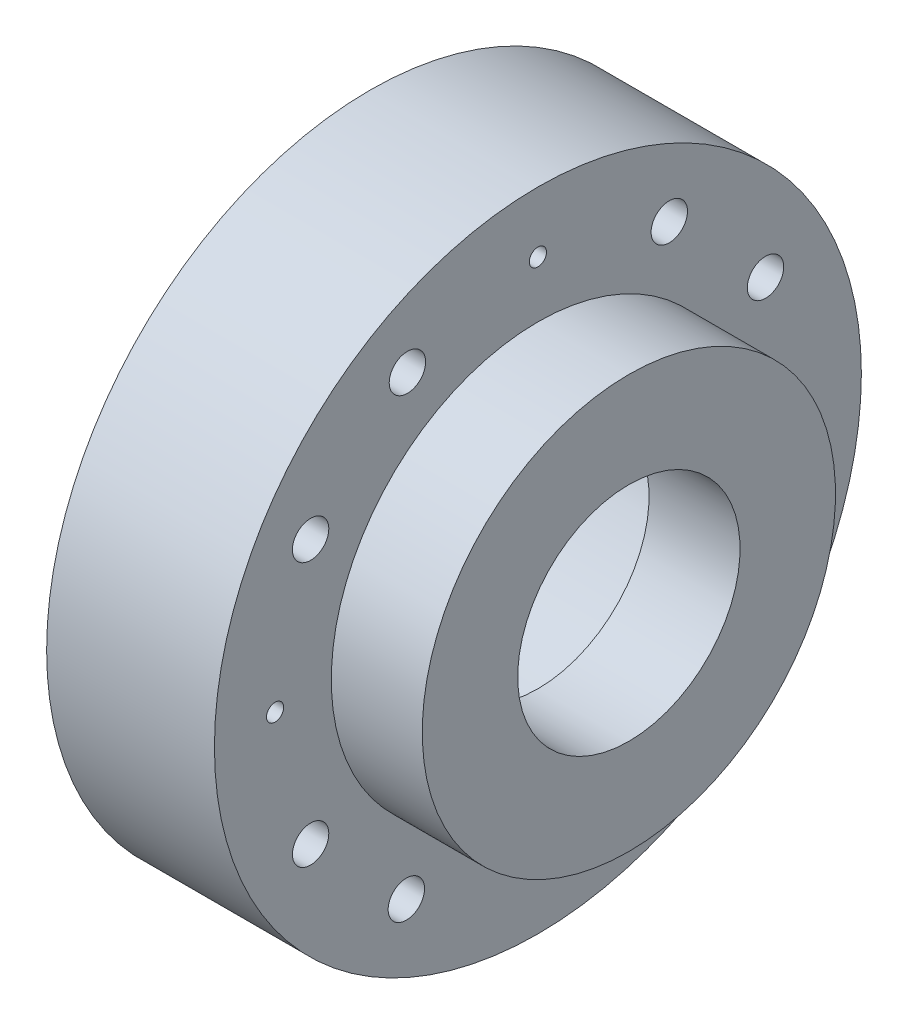
ISO-10303-21;
HEADER;
FILE_DESCRIPTION(('STEP AP214'),'2;1');
FILE_NAME('part.step','',(''),(''),'','','');
FILE_SCHEMA(('AUTOMOTIVE_DESIGN { 1 0 10303 214 1 1 1 1 }'));
ENDSEC;
DATA;
#1=APPLICATION_CONTEXT('core data for automotive mechanical design processes');
#2=APPLICATION_PROTOCOL_DEFINITION('international standard','automotive_design',2000,#1);
#3=PRODUCT_CONTEXT('',#1,'mechanical');
#4=PRODUCT('Part','Part','',(#3));
#5=PRODUCT_RELATED_PRODUCT_CATEGORY('part','',(#4));
#6=PRODUCT_DEFINITION_FORMATION('','',#4);
#7=PRODUCT_DEFINITION_CONTEXT('part definition',#1,'design');
#8=PRODUCT_DEFINITION('design','',#6,#7);
#9=PRODUCT_DEFINITION_SHAPE('','',#8);
#10=(LENGTH_UNIT() NAMED_UNIT(*) SI_UNIT(.MILLI.,.METRE.));
#11=(NAMED_UNIT(*) PLANE_ANGLE_UNIT() SI_UNIT($,.RADIAN.));
#12=(NAMED_UNIT(*) SI_UNIT($,.STERADIAN.) SOLID_ANGLE_UNIT());
#13=UNCERTAINTY_MEASURE_WITH_UNIT(LENGTH_MEASURE(1.E-05),#10,'distance_accuracy_value','');
#14=(GEOMETRIC_REPRESENTATION_CONTEXT(3) GLOBAL_UNCERTAINTY_ASSIGNED_CONTEXT((#13)) GLOBAL_UNIT_ASSIGNED_CONTEXT((#10,
#11,#12)) REPRESENTATION_CONTEXT('',''));
#15=CARTESIAN_POINT('',(0.,0.,0.));
#16=DIRECTION('',(0.,0.,1.));
#17=DIRECTION('',(1.,0.,0.));
#18=AXIS2_PLACEMENT_3D('',#15,#16,#17);
#19=CARTESIAN_POINT('',(0.,0.,0.));
#20=DIRECTION('',(-1.,0.,0.));
#21=DIRECTION('',(0.,-1.,0.));
#22=AXIS2_PLACEMENT_3D('',#19,#20,#21);
#23=PLANE('',#22);
#24=CARTESIAN_POINT('',(0.,0.,0.));
#25=DIRECTION('',(-1.,0.,0.));
#26=DIRECTION('',(0.,-1.,0.));
#27=AXIS2_PLACEMENT_3D('',#24,#25,#26);
#28=CIRCLE('',#27,55.);
#29=CARTESIAN_POINT('',(0.,-55.,0.));
#30=VERTEX_POINT('',#29);
#31=EDGE_CURVE('E215',#30,#30,#28,.T.);
#32=ORIENTED_EDGE('',*,*,#31,.T.);
#33=EDGE_LOOP('',(#32));
#34=FACE_BOUND('',#33,.T.);
#35=CARTESIAN_POINT('',(0.,0.,0.));
#36=DIRECTION('',(-1.,0.,0.));
#37=DIRECTION('',(0.,-1.,0.));
#38=AXIS2_PLACEMENT_3D('',#35,#36,#37);
#39=CIRCLE('',#38,102.2);
#40=CARTESIAN_POINT('',(0.,-102.2,0.));
#41=VERTEX_POINT('',#40);
#42=EDGE_CURVE('E10',#41,#41,#39,.T.);
#43=ORIENTED_EDGE('',*,*,#42,.F.);
#44=EDGE_LOOP('',(#43));
#45=FACE_BOUND('',#44,.T.);
#46=ADVANCED_FACE('F45',(#34,#45),#23,.F.);
#47=CARTESIAN_POINT('',(-45.,0.,0.));
#48=DIRECTION('',(-1.,0.,0.));
#49=DIRECTION('',(0.,-1.,0.));
#50=AXIS2_PLACEMENT_3D('',#47,#48,#49);
#51=CYLINDRICAL_SURFACE('',#50,102.2);
#52=CARTESIAN_POINT('',(-45.,0.,0.));
#53=DIRECTION('',(-1.,0.,0.));
#54=DIRECTION('',(0.,-1.,0.));
#55=AXIS2_PLACEMENT_3D('',#52,#53,#54);
#56=CIRCLE('',#55,102.2);
#57=CARTESIAN_POINT('',(-45.,-102.2,0.));
#58=VERTEX_POINT('',#57);
#59=EDGE_CURVE('E53',#58,#58,#56,.T.);
#60=ORIENTED_EDGE('',*,*,#59,.F.);
#61=EDGE_LOOP('',(#60));
#62=FACE_BOUND('',#61,.T.);
#63=ORIENTED_EDGE('',*,*,#42,.T.);
#64=EDGE_LOOP('',(#63));
#65=FACE_BOUND('',#64,.T.);
#66=ADVANCED_FACE('F260',(#62,#65),#51,.T.);
#67=CARTESIAN_POINT('',(-45.,102.2,0.));
#68=DIRECTION('',(-1.,0.,0.));
#69=DIRECTION('',(0.,-1.,0.));
#70=AXIS2_PLACEMENT_3D('',#67,#68,#69);
#71=PLANE('',#70);
#72=CARTESIAN_POINT('',(-45.,112.844971207046,64.5446548776964));
#73=DIRECTION('',(-1.,0.,0.));
#74=DIRECTION('',(0.,-1.,0.));
#75=AXIS2_PLACEMENT_3D('',#72,#73,#74);
#76=CIRCLE('',#75,9.);
#77=CARTESIAN_POINT('',(-45.,103.844971207046,64.5446548776964));
#78=VERTEX_POINT('',#77);
#79=EDGE_CURVE('E48',#78,#78,#76,.T.);
#80=ORIENTED_EDGE('',*,*,#79,.T.);
#81=EDGE_LOOP('',(#80));
#82=FACE_BOUND('',#81,.T.);
#83=CARTESIAN_POINT('',(-45.,65.2624105998622,112.431391357997));
#84=DIRECTION('',(-1.,0.,0.));
#85=DIRECTION('',(0.,-1.,0.));
#86=AXIS2_PLACEMENT_3D('',#83,#84,#85);
#87=CIRCLE('',#86,9.);
#88=CARTESIAN_POINT('',(-45.,56.2624105998622,112.431391357997));
#89=VERTEX_POINT('',#88);
#90=EDGE_CURVE('E100',#89,#89,#87,.T.);
#91=ORIENTED_EDGE('',*,*,#90,.T.);
#92=EDGE_LOOP('',(#91));
#93=FACE_BOUND('',#92,.T.);
#94=CARTESIAN_POINT('',(-45.,-65.2624105998623,112.431391357997));
#95=DIRECTION('',(-1.,0.,0.));
#96=DIRECTION('',(0.,-1.,0.));
#97=AXIS2_PLACEMENT_3D('',#94,#95,#96);
#98=CIRCLE('',#97,9.00000000000001);
#99=CARTESIAN_POINT('',(-45.,-74.2624105998623,112.431391357997));
#100=VERTEX_POINT('',#99);
#101=EDGE_CURVE('E95',#100,#100,#98,.T.);
#102=ORIENTED_EDGE('',*,*,#101,.T.);
#103=EDGE_LOOP('',(#102));
#104=FACE_BOUND('',#103,.T.);
#105=CARTESIAN_POINT('',(-45.,-112.541950181338,65.0715717451276));
#106=DIRECTION('',(-1.,0.,0.));
#107=DIRECTION('',(0.,-1.,0.));
#108=AXIS2_PLACEMENT_3D('',#105,#106,#107);
#109=CIRCLE('',#108,9.00000000000001);
#110=CARTESIAN_POINT('',(-45.,-121.541950181338,65.0715717451276));
#111=VERTEX_POINT('',#110);
#112=EDGE_CURVE('E89',#111,#111,#109,.T.);
#113=ORIENTED_EDGE('',*,*,#112,.T.);
#114=EDGE_LOOP('',(#113));
#115=FACE_BOUND('',#114,.T.);
#116=CARTESIAN_POINT('',(-45.,-112.623196418356,-64.9308526704548));
#117=DIRECTION('',(-1.,0.,0.));
#118=DIRECTION('',(0.,-1.,0.));
#119=AXIS2_PLACEMENT_3D('',#116,#117,#118);
#120=CIRCLE('',#119,9.);
#121=CARTESIAN_POINT('',(-45.,-121.623196418356,-64.9308526704548));
#122=VERTEX_POINT('',#121);
#123=EDGE_CURVE('E83',#122,#122,#120,.T.);
#124=ORIENTED_EDGE('',*,*,#123,.T.);
#125=EDGE_LOOP('',(#124));
#126=FACE_BOUND('',#125,.T.);
#127=CARTESIAN_POINT('',(-45.,-64.7372357989236,-112.73460117069));
#128=DIRECTION('',(-1.,0.,0.));
#129=DIRECTION('',(0.,-1.,0.));
#130=AXIS2_PLACEMENT_3D('',#127,#128,#129);
#131=CIRCLE('',#130,9.00000000000001);
#132=CARTESIAN_POINT('',(-45.,-73.7372357989236,-112.73460117069));
#133=VERTEX_POINT('',#132);
#134=EDGE_CURVE('E77',#133,#133,#131,.T.);
#135=ORIENTED_EDGE('',*,*,#134,.T.);
#136=EDGE_LOOP('',(#135));
#137=FACE_BOUND('',#136,.T.);
#138=CARTESIAN_POINT('',(-45.,64.9999999999993,-112.583302491977));
#139=DIRECTION('',(-1.,0.,0.));
#140=DIRECTION('',(0.,-1.,0.));
#141=AXIS2_PLACEMENT_3D('',#138,#139,#140);
#142=CIRCLE('',#141,9.);
#143=CARTESIAN_POINT('',(-45.,55.9999999999993,-112.583302491977));
#144=VERTEX_POINT('',#143);
#145=EDGE_CURVE('E71',#144,#144,#142,.T.);
#146=ORIENTED_EDGE('',*,*,#145,.T.);
#147=EDGE_LOOP('',(#146));
#148=FACE_BOUND('',#147,.T.);
#149=CARTESIAN_POINT('',(-45.,112.583302491977,-64.9999999999993));
#150=DIRECTION('',(-1.,0.,0.));
#151=DIRECTION('',(0.,-1.,0.));
#152=AXIS2_PLACEMENT_3D('',#149,#150,#151);
#153=CIRCLE('',#152,9.);
#154=CARTESIAN_POINT('',(-45.,103.583302491977,-64.9999999999993));
#155=VERTEX_POINT('',#154);
#156=EDGE_CURVE('E65',#155,#155,#153,.T.);
#157=ORIENTED_EDGE('',*,*,#156,.T.);
#158=EDGE_LOOP('',(#157));
#159=FACE_BOUND('',#158,.T.);
#160=CARTESIAN_POINT('',(-45.,0.,-130.));
#161=DIRECTION('',(-1.,0.,0.));
#162=DIRECTION('',(0.,-1.,0.));
#163=AXIS2_PLACEMENT_3D('',#160,#161,#162);
#164=CIRCLE('',#163,4.24999999999998);
#165=CARTESIAN_POINT('',(-45.,-4.25,-130.));
#166=VERTEX_POINT('',#165);
#167=EDGE_CURVE('E186',#166,#166,#164,.T.);
#168=ORIENTED_EDGE('',*,*,#167,.T.);
#169=EDGE_LOOP('',(#168));
#170=FACE_BOUND('',#169,.T.);
#171=CARTESIAN_POINT('',(-44.9999999999999,-130.,0.));
#172=DIRECTION('',(-1.,0.,0.));
#173=DIRECTION('',(0.,-1.,0.));
#174=AXIS2_PLACEMENT_3D('',#171,#172,#173);
#175=CIRCLE('',#174,4.24999999999998);
#176=CARTESIAN_POINT('',(-44.9999999999999,-134.25,0.));
#177=VERTEX_POINT('',#176);
#178=EDGE_CURVE('E194',#177,#177,#175,.T.);
#179=ORIENTED_EDGE('',*,*,#178,.T.);
#180=EDGE_LOOP('',(#179));
#181=FACE_BOUND('',#180,.T.);
#182=CARTESIAN_POINT('',(-45.,0.,130.));
#183=DIRECTION('',(-1.,0.,0.));
#184=DIRECTION('',(0.,-1.,0.));
#185=AXIS2_PLACEMENT_3D('',#182,#183,#184);
#186=CIRCLE('',#185,4.24999999999998);
#187=CARTESIAN_POINT('',(-45.,-4.25,130.));
#188=VERTEX_POINT('',#187);
#189=EDGE_CURVE('E202',#188,#188,#186,.T.);
#190=ORIENTED_EDGE('',*,*,#189,.T.);
#191=EDGE_LOOP('',(#190));
#192=FACE_BOUND('',#191,.T.);
#193=CARTESIAN_POINT('',(-45.,130.,0.));
#194=DIRECTION('',(-1.,0.,0.));
#195=DIRECTION('',(0.,-1.,0.));
#196=AXIS2_PLACEMENT_3D('',#193,#194,#195);
#197=CIRCLE('',#196,4.24999999999998);
#198=CARTESIAN_POINT('',(-45.,125.75,0.));
#199=VERTEX_POINT('',#198);
#200=EDGE_CURVE('E210',#199,#199,#197,.T.);
#201=ORIENTED_EDGE('',*,*,#200,.T.);
#202=EDGE_LOOP('',(#201));
#203=FACE_BOUND('',#202,.T.);
#204=CARTESIAN_POINT('',(-45.,0.,0.));
#205=DIRECTION('',(-1.,0.,0.));
#206=DIRECTION('',(0.,-1.,0.));
#207=AXIS2_PLACEMENT_3D('',#204,#205,#206);
#208=CIRCLE('',#207,160.);
#209=CARTESIAN_POINT('',(-44.9999999999999,-160.,0.));
#210=VERTEX_POINT('',#209);
#211=EDGE_CURVE('E61',#210,#210,#208,.T.);
#212=ORIENTED_EDGE('',*,*,#211,.F.);
#213=EDGE_LOOP('',(#212));
#214=FACE_BOUND('',#213,.T.);
#215=ORIENTED_EDGE('',*,*,#59,.T.);
#216=EDGE_LOOP('',(#215));
#217=FACE_BOUND('',#216,.T.);
#218=ADVANCED_FACE('F257',(#82,#93,#104,#115,#126,#137,#148,#159,#170,#181,#192,#203,#214,#217),
#71,.F.);
#219=CARTESIAN_POINT('',(-45.,0.,0.));
#220=DIRECTION('',(-1.,0.,0.));
#221=DIRECTION('',(0.,-1.,0.));
#222=AXIS2_PLACEMENT_3D('',#219,#220,#221);
#223=CYLINDRICAL_SURFACE('',#222,160.);
#224=CARTESIAN_POINT('',(-128.,0.,0.));
#225=DIRECTION('',(-1.,0.,0.));
#226=DIRECTION('',(0.,-1.,0.));
#227=AXIS2_PLACEMENT_3D('',#224,#225,#226);
#228=CIRCLE('',#227,160.);
#229=CARTESIAN_POINT('',(-128.,-160.,0.));
#230=VERTEX_POINT('',#229);
#231=EDGE_CURVE('E246',#230,#230,#228,.T.);
#232=ORIENTED_EDGE('',*,*,#231,.F.);
#233=EDGE_LOOP('',(#232));
#234=FACE_BOUND('',#233,.T.);
#235=ORIENTED_EDGE('',*,*,#211,.T.);
#236=EDGE_LOOP('',(#235));
#237=FACE_BOUND('',#236,.T.);
#238=ADVANCED_FACE('F255',(#234,#237),#223,.T.);
#239=CARTESIAN_POINT('',(-128.,160.,0.));
#240=DIRECTION('',(1.,0.,0.));
#241=DIRECTION('',(0.,1.,0.));
#242=AXIS2_PLACEMENT_3D('',#239,#240,#241);
#243=PLANE('',#242);
#244=CARTESIAN_POINT('',(-128.,0.,0.));
#245=DIRECTION('',(-1.,0.,0.));
#246=DIRECTION('',(0.,-1.,0.));
#247=AXIS2_PLACEMENT_3D('',#244,#245,#246);
#248=CIRCLE('',#247,148.5);
#249=CARTESIAN_POINT('',(-128.,-148.5,0.));
#250=VERTEX_POINT('',#249);
#251=EDGE_CURVE('E242',#250,#250,#248,.T.);
#252=ORIENTED_EDGE('',*,*,#251,.F.);
#253=EDGE_LOOP('',(#252));
#254=FACE_BOUND('',#253,.T.);
#255=ORIENTED_EDGE('',*,*,#231,.T.);
#256=EDGE_LOOP('',(#255));
#257=FACE_BOUND('',#256,.T.);
#258=ADVANCED_FACE('F273',(#254,#257),#243,.F.);
#259=CARTESIAN_POINT('',(-45.,0.,0.));
#260=DIRECTION('',(-1.,0.,0.));
#261=DIRECTION('',(0.,-1.,0.));
#262=AXIS2_PLACEMENT_3D('',#259,#260,#261);
#263=CYLINDRICAL_SURFACE('',#262,148.5);
#264=CARTESIAN_POINT('',(-111.,0.,0.));
#265=DIRECTION('',(-1.,0.,0.));
#266=DIRECTION('',(0.,-1.,0.));
#267=AXIS2_PLACEMENT_3D('',#264,#265,#266);
#268=CIRCLE('',#267,148.5);
#269=CARTESIAN_POINT('',(-111.,-148.5,0.));
#270=VERTEX_POINT('',#269);
#271=EDGE_CURVE('E238',#270,#270,#268,.T.);
#272=ORIENTED_EDGE('',*,*,#271,.F.);
#273=EDGE_LOOP('',(#272));
#274=FACE_BOUND('',#273,.T.);
#275=ORIENTED_EDGE('',*,*,#251,.T.);
#276=EDGE_LOOP('',(#275));
#277=FACE_BOUND('',#276,.T.);
#278=ADVANCED_FACE('F277',(#274,#277),#263,.F.);
#279=CARTESIAN_POINT('',(-111.,148.5,0.));
#280=DIRECTION('',(1.,0.,0.));
#281=DIRECTION('',(0.,1.,0.));
#282=AXIS2_PLACEMENT_3D('',#279,#280,#281);
#283=PLANE('',#282);
#284=CARTESIAN_POINT('',(-111.,112.844971207046,64.5446548776964));
#285=DIRECTION('',(-1.,0.,0.));
#286=DIRECTION('',(0.,0.,1.));
#287=AXIS2_PLACEMENT_3D('',#284,#285,#286);
#288=CIRCLE('',#287,12.5);
#289=CARTESIAN_POINT('',(-111.,112.844971207046,77.0446548776965));
#290=VERTEX_POINT('',#289);
#291=EDGE_CURVE('E424',#290,#290,#288,.T.);
#292=ORIENTED_EDGE('',*,*,#291,.F.);
#293=EDGE_LOOP('',(#292));
#294=FACE_BOUND('',#293,.T.);
#295=CARTESIAN_POINT('',(-111.,65.2624105998622,112.431391357997));
#296=DIRECTION('',(-1.,0.,0.));
#297=DIRECTION('',(0.,0.,1.));
#298=AXIS2_PLACEMENT_3D('',#295,#296,#297);
#299=CIRCLE('',#298,12.5);
#300=CARTESIAN_POINT('',(-111.,65.2624105998622,124.931391357997));
#301=VERTEX_POINT('',#300);
#302=EDGE_CURVE('E123',#301,#301,#299,.T.);
#303=ORIENTED_EDGE('',*,*,#302,.F.);
#304=EDGE_LOOP('',(#303));
#305=FACE_BOUND('',#304,.T.);
#306=CARTESIAN_POINT('',(-111.,-65.2624105998623,112.431391357997));
#307=DIRECTION('',(-1.,0.,0.));
#308=DIRECTION('',(0.,0.,1.));
#309=AXIS2_PLACEMENT_3D('',#306,#307,#308);
#310=CIRCLE('',#309,12.5);
#311=CARTESIAN_POINT('',(-111.,-65.2624105998623,124.931391357997));
#312=VERTEX_POINT('',#311);
#313=EDGE_CURVE('E103',#312,#312,#310,.T.);
#314=ORIENTED_EDGE('',*,*,#313,.F.);
#315=EDGE_LOOP('',(#314));
#316=FACE_BOUND('',#315,.T.);
#317=CARTESIAN_POINT('',(-111.,-112.541950181338,65.0715717451276));
#318=DIRECTION('',(-1.,0.,0.));
#319=DIRECTION('',(0.,0.,1.));
#320=AXIS2_PLACEMENT_3D('',#317,#318,#319);
#321=CIRCLE('',#320,12.5);
#322=CARTESIAN_POINT('',(-111.,-112.541950181338,77.5715717451277));
#323=VERTEX_POINT('',#322);
#324=EDGE_CURVE('E98',#323,#323,#321,.T.);
#325=ORIENTED_EDGE('',*,*,#324,.F.);
#326=EDGE_LOOP('',(#325));
#327=FACE_BOUND('',#326,.T.);
#328=CARTESIAN_POINT('',(-111.,-112.623196418356,-64.9308526704548));
#329=DIRECTION('',(-1.,0.,0.));
#330=DIRECTION('',(0.,0.,1.));
#331=AXIS2_PLACEMENT_3D('',#328,#329,#330);
#332=CIRCLE('',#331,12.5);
#333=CARTESIAN_POINT('',(-111.,-112.623196418356,-52.4308526704548));
#334=VERTEX_POINT('',#333);
#335=EDGE_CURVE('E93',#334,#334,#332,.T.);
#336=ORIENTED_EDGE('',*,*,#335,.F.);
#337=EDGE_LOOP('',(#336));
#338=FACE_BOUND('',#337,.T.);
#339=CARTESIAN_POINT('',(-111.,-64.7372357989236,-112.73460117069));
#340=DIRECTION('',(-1.,0.,0.));
#341=DIRECTION('',(0.,0.,1.));
#342=AXIS2_PLACEMENT_3D('',#339,#340,#341);
#343=CIRCLE('',#342,12.5);
#344=CARTESIAN_POINT('',(-111.,-64.7372357989236,-100.23460117069));
#345=VERTEX_POINT('',#344);
#346=EDGE_CURVE('E87',#345,#345,#343,.T.);
#347=ORIENTED_EDGE('',*,*,#346,.F.);
#348=EDGE_LOOP('',(#347));
#349=FACE_BOUND('',#348,.T.);
#350=CARTESIAN_POINT('',(-111.,64.9999999999993,-112.583302491977));
#351=DIRECTION('',(-1.,0.,0.));
#352=DIRECTION('',(0.,0.,1.));
#353=AXIS2_PLACEMENT_3D('',#350,#351,#352);
#354=CIRCLE('',#353,12.5);
#355=CARTESIAN_POINT('',(-111.,64.9999999999993,-100.083302491977));
#356=VERTEX_POINT('',#355);
#357=EDGE_CURVE('E81',#356,#356,#354,.T.);
#358=ORIENTED_EDGE('',*,*,#357,.F.);
#359=EDGE_LOOP('',(#358));
#360=FACE_BOUND('',#359,.T.);
#361=CARTESIAN_POINT('',(-111.,112.583302491977,-64.9999999999993));
#362=DIRECTION('',(-1.,0.,0.));
#363=DIRECTION('',(0.,0.,1.));
#364=AXIS2_PLACEMENT_3D('',#361,#362,#363);
#365=CIRCLE('',#364,12.5);
#366=CARTESIAN_POINT('',(-111.,112.583302491977,-52.4999999999993));
#367=VERTEX_POINT('',#366);
#368=EDGE_CURVE('E75',#367,#367,#365,.T.);
#369=ORIENTED_EDGE('',*,*,#368,.F.);
#370=EDGE_LOOP('',(#369));
#371=FACE_BOUND('',#370,.T.);
#372=CARTESIAN_POINT('',(-111.,0.,-130.));
#373=DIRECTION('',(-1.,0.,0.));
#374=DIRECTION('',(0.,0.,1.));
#375=AXIS2_PLACEMENT_3D('',#372,#373,#374);
#376=CIRCLE('',#375,4.24999999999999);
#377=CARTESIAN_POINT('',(-111.,0.,-125.75));
#378=VERTEX_POINT('',#377);
#379=EDGE_CURVE('E69',#378,#378,#376,.T.);
#380=ORIENTED_EDGE('',*,*,#379,.F.);
#381=EDGE_LOOP('',(#380));
#382=FACE_BOUND('',#381,.T.);
#383=CARTESIAN_POINT('',(-111.,-130.,0.));
#384=DIRECTION('',(-1.,0.,0.));
#385=DIRECTION('',(0.,0.,1.));
#386=AXIS2_PLACEMENT_3D('',#383,#384,#385);
#387=CIRCLE('',#386,4.24999999999998);
#388=CARTESIAN_POINT('',(-111.,-130.,4.24999999999998));
#389=VERTEX_POINT('',#388);
#390=EDGE_CURVE('E190',#389,#389,#387,.T.);
#391=ORIENTED_EDGE('',*,*,#390,.F.);
#392=EDGE_LOOP('',(#391));
#393=FACE_BOUND('',#392,.T.);
#394=CARTESIAN_POINT('',(-111.,0.,130.));
#395=DIRECTION('',(-1.,0.,0.));
#396=DIRECTION('',(0.,0.,1.));
#397=AXIS2_PLACEMENT_3D('',#394,#395,#396);
#398=CIRCLE('',#397,4.24999999999999);
#399=CARTESIAN_POINT('',(-111.,0.,134.25));
#400=VERTEX_POINT('',#399);
#401=EDGE_CURVE('E198',#400,#400,#398,.T.);
#402=ORIENTED_EDGE('',*,*,#401,.F.);
#403=EDGE_LOOP('',(#402));
#404=FACE_BOUND('',#403,.T.);
#405=CARTESIAN_POINT('',(-111.,130.,0.));
#406=DIRECTION('',(-1.,0.,0.));
#407=DIRECTION('',(0.,0.,1.));
#408=AXIS2_PLACEMENT_3D('',#405,#406,#407);
#409=CIRCLE('',#408,4.24999999999998);
#410=CARTESIAN_POINT('',(-111.,130.,4.24999999999998));
#411=VERTEX_POINT('',#410);
#412=EDGE_CURVE('E206',#411,#411,#409,.T.);
#413=ORIENTED_EDGE('',*,*,#412,.F.);
#414=EDGE_LOOP('',(#413));
#415=FACE_BOUND('',#414,.T.);
#416=CARTESIAN_POINT('',(-111.,0.,0.));
#417=DIRECTION('',(-1.,0.,0.));
#418=DIRECTION('',(0.,-1.,0.));
#419=AXIS2_PLACEMENT_3D('',#416,#417,#418);
#420=CIRCLE('',#419,100.);
#421=CARTESIAN_POINT('',(-111.,-100.,0.));
#422=VERTEX_POINT('',#421);
#423=EDGE_CURVE('E234',#422,#422,#420,.T.);
#424=ORIENTED_EDGE('',*,*,#423,.F.);
#425=EDGE_LOOP('',(#424));
#426=FACE_BOUND('',#425,.T.);
#427=ORIENTED_EDGE('',*,*,#271,.T.);
#428=EDGE_LOOP('',(#427));
#429=FACE_BOUND('',#428,.T.);
#430=ADVANCED_FACE('F281',(#294,#305,#316,#327,#338,#349,#360,#371,#382,#393,#404,#415,#426,
#429),#283,.F.);
#431=CARTESIAN_POINT('',(-45.,0.,0.));
#432=DIRECTION('',(-1.,0.,0.));
#433=DIRECTION('',(0.,-1.,0.));
#434=AXIS2_PLACEMENT_3D('',#431,#432,#433);
#435=CYLINDRICAL_SURFACE('',#434,100.);
#436=CARTESIAN_POINT('',(-58.,0.,0.));
#437=DIRECTION('',(-1.,0.,0.));
#438=DIRECTION('',(0.,-1.,0.));
#439=AXIS2_PLACEMENT_3D('',#436,#437,#438);
#440=CIRCLE('',#439,100.);
#441=CARTESIAN_POINT('',(-58.,-100.,0.));
#442=VERTEX_POINT('',#441);
#443=EDGE_CURVE('E230',#442,#442,#440,.T.);
#444=ORIENTED_EDGE('',*,*,#443,.F.);
#445=EDGE_LOOP('',(#444));
#446=FACE_BOUND('',#445,.T.);
#447=ORIENTED_EDGE('',*,*,#423,.T.);
#448=EDGE_LOOP('',(#447));
#449=FACE_BOUND('',#448,.T.);
#450=ADVANCED_FACE('F285',(#446,#449),#435,.F.);
#451=CARTESIAN_POINT('',(-58.,100.,0.));
#452=DIRECTION('',(1.,0.,0.));
#453=DIRECTION('',(0.,1.,0.));
#454=AXIS2_PLACEMENT_3D('',#451,#452,#453);
#455=PLANE('',#454);
#456=CARTESIAN_POINT('',(-58.,0.,0.));
#457=DIRECTION('',(-1.,0.,0.));
#458=DIRECTION('',(0.,-1.,0.));
#459=AXIS2_PLACEMENT_3D('',#456,#457,#458);
#460=CIRCLE('',#459,75.);
#461=CARTESIAN_POINT('',(-58.,-75.,0.));
#462=VERTEX_POINT('',#461);
#463=EDGE_CURVE('E226',#462,#462,#460,.T.);
#464=ORIENTED_EDGE('',*,*,#463,.F.);
#465=EDGE_LOOP('',(#464));
#466=FACE_BOUND('',#465,.T.);
#467=ORIENTED_EDGE('',*,*,#443,.T.);
#468=EDGE_LOOP('',(#467));
#469=FACE_BOUND('',#468,.T.);
#470=ADVANCED_FACE('F289',(#466,#469),#455,.F.);
#471=CARTESIAN_POINT('',(-45.,0.,0.));
#472=DIRECTION('',(-1.,0.,0.));
#473=DIRECTION('',(0.,-1.,0.));
#474=AXIS2_PLACEMENT_3D('',#471,#472,#473);
#475=CYLINDRICAL_SURFACE('',#474,75.);
#476=CARTESIAN_POINT('',(-45.,0.,0.));
#477=DIRECTION('',(-1.,0.,0.));
#478=DIRECTION('',(0.,-1.,0.));
#479=AXIS2_PLACEMENT_3D('',#476,#477,#478);
#480=CIRCLE('',#479,75.);
#481=CARTESIAN_POINT('',(-45.,-75.,0.));
#482=VERTEX_POINT('',#481);
#483=EDGE_CURVE('E219',#482,#482,#480,.T.);
#484=ORIENTED_EDGE('',*,*,#483,.F.);
#485=EDGE_LOOP('',(#484));
#486=FACE_BOUND('',#485,.T.);
#487=ORIENTED_EDGE('',*,*,#463,.T.);
#488=EDGE_LOOP('',(#487));
#489=FACE_BOUND('',#488,.T.);
#490=ADVANCED_FACE('F293',(#486,#489),#475,.F.);
#491=CARTESIAN_POINT('',(-45.,75.,0.));
#492=DIRECTION('',(1.,0.,0.));
#493=DIRECTION('',(0.,1.,0.));
#494=AXIS2_PLACEMENT_3D('',#491,#492,#493);
#495=PLANE('',#494);
#496=CARTESIAN_POINT('',(-45.,0.,0.));
#497=DIRECTION('',(-1.,0.,0.));
#498=DIRECTION('',(0.,-1.,0.));
#499=AXIS2_PLACEMENT_3D('',#496,#497,#498);
#500=CIRCLE('',#499,55.);
#501=CARTESIAN_POINT('',(-45.,-55.,0.));
#502=VERTEX_POINT('',#501);
#503=EDGE_CURVE('E214',#502,#502,#500,.T.);
#504=ORIENTED_EDGE('',*,*,#503,.F.);
#505=EDGE_LOOP('',(#504));
#506=FACE_BOUND('',#505,.T.);
#507=ORIENTED_EDGE('',*,*,#483,.T.);
#508=EDGE_LOOP('',(#507));
#509=FACE_BOUND('',#508,.T.);
#510=ADVANCED_FACE('F297',(#506,#509),#495,.F.);
#511=CARTESIAN_POINT('',(0.,0.,0.));
#512=DIRECTION('',(-1.,0.,0.));
#513=DIRECTION('',(0.,-1.,0.));
#514=AXIS2_PLACEMENT_3D('',#511,#512,#513);
#515=CYLINDRICAL_SURFACE('',#514,55.);
#516=ORIENTED_EDGE('',*,*,#31,.F.);
#517=EDGE_LOOP('',(#516));
#518=FACE_BOUND('',#517,.T.);
#519=ORIENTED_EDGE('',*,*,#503,.T.);
#520=EDGE_LOOP('',(#519));
#521=FACE_BOUND('',#520,.T.);
#522=ADVANCED_FACE('F301',(#518,#521),#515,.F.);
#523=CARTESIAN_POINT('',(-111.,130.,0.));
#524=DIRECTION('',(-1.,0.,0.));
#525=DIRECTION('',(0.,0.,1.));
#526=AXIS2_PLACEMENT_3D('',#523,#524,#525);
#527=CYLINDRICAL_SURFACE('',#526,4.24999999999998);
#528=ORIENTED_EDGE('',*,*,#412,.T.);
#529=EDGE_LOOP('',(#528));
#530=FACE_BOUND('',#529,.T.);
#531=ORIENTED_EDGE('',*,*,#200,.F.);
#532=EDGE_LOOP('',(#531));
#533=FACE_BOUND('',#532,.T.);
#534=ADVANCED_FACE('F305',(#530,#533),#527,.F.);
#535=CARTESIAN_POINT('',(-111.,0.,130.));
#536=DIRECTION('',(-1.,0.,0.));
#537=DIRECTION('',(0.,0.,1.));
#538=AXIS2_PLACEMENT_3D('',#535,#536,#537);
#539=CYLINDRICAL_SURFACE('',#538,4.24999999999998);
#540=ORIENTED_EDGE('',*,*,#401,.T.);
#541=EDGE_LOOP('',(#540));
#542=FACE_BOUND('',#541,.T.);
#543=ORIENTED_EDGE('',*,*,#189,.F.);
#544=EDGE_LOOP('',(#543));
#545=FACE_BOUND('',#544,.T.);
#546=ADVANCED_FACE('F309',(#542,#545),#539,.F.);
#547=CARTESIAN_POINT('',(-111.,-130.,0.));
#548=DIRECTION('',(-1.,0.,0.));
#549=DIRECTION('',(0.,0.,1.));
#550=AXIS2_PLACEMENT_3D('',#547,#548,#549);
#551=CYLINDRICAL_SURFACE('',#550,4.24999999999998);
#552=ORIENTED_EDGE('',*,*,#390,.T.);
#553=EDGE_LOOP('',(#552));
#554=FACE_BOUND('',#553,.T.);
#555=ORIENTED_EDGE('',*,*,#178,.F.);
#556=EDGE_LOOP('',(#555));
#557=FACE_BOUND('',#556,.T.);
#558=ADVANCED_FACE('F313',(#554,#557),#551,.F.);
#559=CARTESIAN_POINT('',(-111.,0.,-130.));
#560=DIRECTION('',(-1.,0.,0.));
#561=DIRECTION('',(0.,0.,1.));
#562=AXIS2_PLACEMENT_3D('',#559,#560,#561);
#563=CYLINDRICAL_SURFACE('',#562,4.24999999999998);
#564=ORIENTED_EDGE('',*,*,#379,.T.);
#565=EDGE_LOOP('',(#564));
#566=FACE_BOUND('',#565,.T.);
#567=ORIENTED_EDGE('',*,*,#167,.F.);
#568=EDGE_LOOP('',(#567));
#569=FACE_BOUND('',#568,.T.);
#570=ADVANCED_FACE('F317',(#566,#569),#563,.F.);
#571=CARTESIAN_POINT('',(-111.,112.583302491977,-64.9999999999993));
#572=DIRECTION('',(-1.,0.,0.));
#573=DIRECTION('',(0.,0.,1.));
#574=AXIS2_PLACEMENT_3D('',#571,#572,#573);
#575=CYLINDRICAL_SURFACE('',#574,9.);
#576=CARTESIAN_POINT('',(-71.,112.583302491977,-64.9999999999993));
#577=DIRECTION('',(-1.,0.,0.));
#578=DIRECTION('',(0.,0.,1.));
#579=AXIS2_PLACEMENT_3D('',#576,#577,#578);
#580=CIRCLE('',#579,9.00000000000001);
#581=CARTESIAN_POINT('',(-71.,112.583302491977,-55.9999999999993));
#582=VERTEX_POINT('',#581);
#583=EDGE_CURVE('E70',#582,#582,#580,.T.);
#584=ORIENTED_EDGE('',*,*,#583,.T.);
#585=EDGE_LOOP('',(#584));
#586=FACE_BOUND('',#585,.T.);
#587=ORIENTED_EDGE('',*,*,#156,.F.);
#588=EDGE_LOOP('',(#587));
#589=FACE_BOUND('',#588,.T.);
#590=ADVANCED_FACE('F321',(#586,#589),#575,.F.);
#591=CARTESIAN_POINT('',(-71.,121.583302491977,-64.9999999999993));
#592=DIRECTION('',(1.,0.,0.));
#593=DIRECTION('',(0.,0.,-1.));
#594=AXIS2_PLACEMENT_3D('',#591,#592,#593);
#595=PLANE('',#594);
#596=ORIENTED_EDGE('',*,*,#583,.F.);
#597=EDGE_LOOP('',(#596));
#598=FACE_BOUND('',#597,.T.);
#599=CARTESIAN_POINT('',(-71.,112.583302491977,-64.9999999999993));
#600=DIRECTION('',(-1.,0.,0.));
#601=DIRECTION('',(0.,0.,1.));
#602=AXIS2_PLACEMENT_3D('',#599,#600,#601);
#603=CIRCLE('',#602,12.5);
#604=CARTESIAN_POINT('',(-71.,112.583302491977,-52.4999999999993));
#605=VERTEX_POINT('',#604);
#606=EDGE_CURVE('E176',#605,#605,#603,.T.);
#607=ORIENTED_EDGE('',*,*,#606,.T.);
#608=EDGE_LOOP('',(#607));
#609=FACE_BOUND('',#608,.T.);
#610=ADVANCED_FACE('F325',(#598,#609),#595,.F.);
#611=CARTESIAN_POINT('',(-111.,112.583302491977,-64.9999999999993));
#612=DIRECTION('',(-1.,0.,0.));
#613=DIRECTION('',(0.,0.,1.));
#614=AXIS2_PLACEMENT_3D('',#611,#612,#613);
#615=CYLINDRICAL_SURFACE('',#614,12.5);
#616=ORIENTED_EDGE('',*,*,#606,.F.);
#617=EDGE_LOOP('',(#616));
#618=FACE_BOUND('',#617,.T.);
#619=ORIENTED_EDGE('',*,*,#368,.T.);
#620=EDGE_LOOP('',(#619));
#621=FACE_BOUND('',#620,.T.);
#622=ADVANCED_FACE('F329',(#618,#621),#615,.F.);
#623=CARTESIAN_POINT('',(-111.,64.9999999999993,-112.583302491977));
#624=DIRECTION('',(-1.,0.,0.));
#625=DIRECTION('',(0.,0.,1.));
#626=AXIS2_PLACEMENT_3D('',#623,#624,#625);
#627=CYLINDRICAL_SURFACE('',#626,9.);
#628=CARTESIAN_POINT('',(-71.,64.9999999999993,-112.583302491977));
#629=DIRECTION('',(-1.,0.,0.));
#630=DIRECTION('',(0.,0.,1.));
#631=AXIS2_PLACEMENT_3D('',#628,#629,#630);
#632=CIRCLE('',#631,9.00000000000001);
#633=CARTESIAN_POINT('',(-71.,64.9999999999993,-103.583302491977));
#634=VERTEX_POINT('',#633);
#635=EDGE_CURVE('E76',#634,#634,#632,.T.);
#636=ORIENTED_EDGE('',*,*,#635,.T.);
#637=EDGE_LOOP('',(#636));
#638=FACE_BOUND('',#637,.T.);
#639=ORIENTED_EDGE('',*,*,#145,.F.);
#640=EDGE_LOOP('',(#639));
#641=FACE_BOUND('',#640,.T.);
#642=ADVANCED_FACE('F333',(#638,#641),#627,.F.);
#643=CARTESIAN_POINT('',(-71.,73.9999999999993,-112.583302491977));
#644=DIRECTION('',(1.,0.,0.));
#645=DIRECTION('',(0.,0.,-1.));
#646=AXIS2_PLACEMENT_3D('',#643,#644,#645);
#647=PLANE('',#646);
#648=ORIENTED_EDGE('',*,*,#635,.F.);
#649=EDGE_LOOP('',(#648));
#650=FACE_BOUND('',#649,.T.);
#651=CARTESIAN_POINT('',(-71.,64.9999999999993,-112.583302491977));
#652=DIRECTION('',(-1.,0.,0.));
#653=DIRECTION('',(0.,0.,1.));
#654=AXIS2_PLACEMENT_3D('',#651,#652,#653);
#655=CIRCLE('',#654,12.5);
#656=CARTESIAN_POINT('',(-71.,64.9999999999993,-100.083302491977));
#657=VERTEX_POINT('',#656);
#658=EDGE_CURVE('E166',#657,#657,#655,.T.);
#659=ORIENTED_EDGE('',*,*,#658,.T.);
#660=EDGE_LOOP('',(#659));
#661=FACE_BOUND('',#660,.T.);
#662=ADVANCED_FACE('F337',(#650,#661),#647,.F.);
#663=CARTESIAN_POINT('',(-111.,64.9999999999993,-112.583302491977));
#664=DIRECTION('',(-1.,0.,0.));
#665=DIRECTION('',(0.,0.,1.));
#666=AXIS2_PLACEMENT_3D('',#663,#664,#665);
#667=CYLINDRICAL_SURFACE('',#666,12.5);
#668=ORIENTED_EDGE('',*,*,#658,.F.);
#669=EDGE_LOOP('',(#668));
#670=FACE_BOUND('',#669,.T.);
#671=ORIENTED_EDGE('',*,*,#357,.T.);
#672=EDGE_LOOP('',(#671));
#673=FACE_BOUND('',#672,.T.);
#674=ADVANCED_FACE('F341',(#670,#673),#667,.F.);
#675=CARTESIAN_POINT('',(-111.,-64.7372357989236,-112.73460117069));
#676=DIRECTION('',(-1.,0.,0.));
#677=DIRECTION('',(0.,0.,1.));
#678=AXIS2_PLACEMENT_3D('',#675,#676,#677);
#679=CYLINDRICAL_SURFACE('',#678,9.00000000000001);
#680=CARTESIAN_POINT('',(-71.,-64.7372357989236,-112.73460117069));
#681=DIRECTION('',(-1.,0.,0.));
#682=DIRECTION('',(0.,0.,1.));
#683=AXIS2_PLACEMENT_3D('',#680,#681,#682);
#684=CIRCLE('',#683,9.00000000000001);
#685=CARTESIAN_POINT('',(-71.,-64.7372357989236,-103.73460117069));
#686=VERTEX_POINT('',#685);
#687=EDGE_CURVE('E82',#686,#686,#684,.T.);
#688=ORIENTED_EDGE('',*,*,#687,.T.);
#689=EDGE_LOOP('',(#688));
#690=FACE_BOUND('',#689,.T.);
#691=ORIENTED_EDGE('',*,*,#134,.F.);
#692=EDGE_LOOP('',(#691));
#693=FACE_BOUND('',#692,.T.);
#694=ADVANCED_FACE('F345',(#690,#693),#679,.F.);
#695=CARTESIAN_POINT('',(-71.,-55.7372357989236,-112.73460117069));
#696=DIRECTION('',(1.,0.,0.));
#697=DIRECTION('',(0.,0.,-1.));
#698=AXIS2_PLACEMENT_3D('',#695,#696,#697);
#699=PLANE('',#698);
#700=ORIENTED_EDGE('',*,*,#687,.F.);
#701=EDGE_LOOP('',(#700));
#702=FACE_BOUND('',#701,.T.);
#703=CARTESIAN_POINT('',(-71.,-64.7372357989236,-112.73460117069));
#704=DIRECTION('',(-1.,0.,0.));
#705=DIRECTION('',(0.,0.,1.));
#706=AXIS2_PLACEMENT_3D('',#703,#704,#705);
#707=CIRCLE('',#706,12.5);
#708=CARTESIAN_POINT('',(-71.,-64.7372357989236,-100.23460117069));
#709=VERTEX_POINT('',#708);
#710=EDGE_CURVE('E156',#709,#709,#707,.T.);
#711=ORIENTED_EDGE('',*,*,#710,.T.);
#712=EDGE_LOOP('',(#711));
#713=FACE_BOUND('',#712,.T.);
#714=ADVANCED_FACE('F349',(#702,#713),#699,.F.);
#715=CARTESIAN_POINT('',(-111.,-64.7372357989236,-112.73460117069));
#716=DIRECTION('',(-1.,0.,0.));
#717=DIRECTION('',(0.,0.,1.));
#718=AXIS2_PLACEMENT_3D('',#715,#716,#717);
#719=CYLINDRICAL_SURFACE('',#718,12.5);
#720=ORIENTED_EDGE('',*,*,#710,.F.);
#721=EDGE_LOOP('',(#720));
#722=FACE_BOUND('',#721,.T.);
#723=ORIENTED_EDGE('',*,*,#346,.T.);
#724=EDGE_LOOP('',(#723));
#725=FACE_BOUND('',#724,.T.);
#726=ADVANCED_FACE('F353',(#722,#725),#719,.F.);
#727=CARTESIAN_POINT('',(-111.,-112.623196418356,-64.9308526704548));
#728=DIRECTION('',(-1.,0.,0.));
#729=DIRECTION('',(0.,0.,1.));
#730=AXIS2_PLACEMENT_3D('',#727,#728,#729);
#731=CYLINDRICAL_SURFACE('',#730,9.);
#732=CARTESIAN_POINT('',(-71.,-112.623196418356,-64.9308526704548));
#733=DIRECTION('',(-1.,0.,0.));
#734=DIRECTION('',(0.,0.,1.));
#735=AXIS2_PLACEMENT_3D('',#732,#733,#734);
#736=CIRCLE('',#735,9.00000000000001);
#737=CARTESIAN_POINT('',(-71.,-112.623196418356,-55.9308526704548));
#738=VERTEX_POINT('',#737);
#739=EDGE_CURVE('E88',#738,#738,#736,.T.);
#740=ORIENTED_EDGE('',*,*,#739,.T.);
#741=EDGE_LOOP('',(#740));
#742=FACE_BOUND('',#741,.T.);
#743=ORIENTED_EDGE('',*,*,#123,.F.);
#744=EDGE_LOOP('',(#743));
#745=FACE_BOUND('',#744,.T.);
#746=ADVANCED_FACE('F357',(#742,#745),#731,.F.);
#747=CARTESIAN_POINT('',(-71.,-103.623196418356,-64.9308526704548));
#748=DIRECTION('',(1.,0.,0.));
#749=DIRECTION('',(0.,0.,-1.));
#750=AXIS2_PLACEMENT_3D('',#747,#748,#749);
#751=PLANE('',#750);
#752=ORIENTED_EDGE('',*,*,#739,.F.);
#753=EDGE_LOOP('',(#752));
#754=FACE_BOUND('',#753,.T.);
#755=CARTESIAN_POINT('',(-71.,-112.623196418356,-64.9308526704548));
#756=DIRECTION('',(-1.,0.,0.));
#757=DIRECTION('',(0.,0.,1.));
#758=AXIS2_PLACEMENT_3D('',#755,#756,#757);
#759=CIRCLE('',#758,12.5);
#760=CARTESIAN_POINT('',(-71.,-112.623196418356,-52.4308526704548));
#761=VERTEX_POINT('',#760);
#762=EDGE_CURVE('E146',#761,#761,#759,.T.);
#763=ORIENTED_EDGE('',*,*,#762,.T.);
#764=EDGE_LOOP('',(#763));
#765=FACE_BOUND('',#764,.T.);
#766=ADVANCED_FACE('F361',(#754,#765),#751,.F.);
#767=CARTESIAN_POINT('',(-111.,-112.623196418356,-64.9308526704548));
#768=DIRECTION('',(-1.,0.,0.));
#769=DIRECTION('',(0.,0.,1.));
#770=AXIS2_PLACEMENT_3D('',#767,#768,#769);
#771=CYLINDRICAL_SURFACE('',#770,12.5);
#772=ORIENTED_EDGE('',*,*,#762,.F.);
#773=EDGE_LOOP('',(#772));
#774=FACE_BOUND('',#773,.T.);
#775=ORIENTED_EDGE('',*,*,#335,.T.);
#776=EDGE_LOOP('',(#775));
#777=FACE_BOUND('',#776,.T.);
#778=ADVANCED_FACE('F365',(#774,#777),#771,.F.);
#779=CARTESIAN_POINT('',(-111.,-112.541950181338,65.0715717451276));
#780=DIRECTION('',(-1.,0.,0.));
#781=DIRECTION('',(0.,0.,1.));
#782=AXIS2_PLACEMENT_3D('',#779,#780,#781);
#783=CYLINDRICAL_SURFACE('',#782,9.00000000000001);
#784=CARTESIAN_POINT('',(-71.,-112.541950181338,65.0715717451276));
#785=DIRECTION('',(-1.,0.,0.));
#786=DIRECTION('',(0.,0.,1.));
#787=AXIS2_PLACEMENT_3D('',#784,#785,#786);
#788=CIRCLE('',#787,9.00000000000001);
#789=CARTESIAN_POINT('',(-71.,-112.541950181338,74.0715717451277));
#790=VERTEX_POINT('',#789);
#791=EDGE_CURVE('E94',#790,#790,#788,.T.);
#792=ORIENTED_EDGE('',*,*,#791,.T.);
#793=EDGE_LOOP('',(#792));
#794=FACE_BOUND('',#793,.T.);
#795=ORIENTED_EDGE('',*,*,#112,.F.);
#796=EDGE_LOOP('',(#795));
#797=FACE_BOUND('',#796,.T.);
#798=ADVANCED_FACE('F369',(#794,#797),#783,.F.);
#799=CARTESIAN_POINT('',(-71.,-103.541950181338,65.0715717451276));
#800=DIRECTION('',(1.,0.,0.));
#801=DIRECTION('',(0.,0.,-1.));
#802=AXIS2_PLACEMENT_3D('',#799,#800,#801);
#803=PLANE('',#802);
#804=ORIENTED_EDGE('',*,*,#791,.F.);
#805=EDGE_LOOP('',(#804));
#806=FACE_BOUND('',#805,.T.);
#807=CARTESIAN_POINT('',(-71.,-112.541950181338,65.0715717451276));
#808=DIRECTION('',(-1.,0.,0.));
#809=DIRECTION('',(0.,0.,1.));
#810=AXIS2_PLACEMENT_3D('',#807,#808,#809);
#811=CIRCLE('',#810,12.5);
#812=CARTESIAN_POINT('',(-71.,-112.541950181338,77.5715717451277));
#813=VERTEX_POINT('',#812);
#814=EDGE_CURVE('E136',#813,#813,#811,.T.);
#815=ORIENTED_EDGE('',*,*,#814,.T.);
#816=EDGE_LOOP('',(#815));
#817=FACE_BOUND('',#816,.T.);
#818=ADVANCED_FACE('F373',(#806,#817),#803,.F.);
#819=CARTESIAN_POINT('',(-111.,-112.541950181338,65.0715717451276));
#820=DIRECTION('',(-1.,0.,0.));
#821=DIRECTION('',(0.,0.,1.));
#822=AXIS2_PLACEMENT_3D('',#819,#820,#821);
#823=CYLINDRICAL_SURFACE('',#822,12.5);
#824=ORIENTED_EDGE('',*,*,#814,.F.);
#825=EDGE_LOOP('',(#824));
#826=FACE_BOUND('',#825,.T.);
#827=ORIENTED_EDGE('',*,*,#324,.T.);
#828=EDGE_LOOP('',(#827));
#829=FACE_BOUND('',#828,.T.);
#830=ADVANCED_FACE('F377',(#826,#829),#823,.F.);
#831=CARTESIAN_POINT('',(-111.,-65.2624105998623,112.431391357997));
#832=DIRECTION('',(-1.,0.,0.));
#833=DIRECTION('',(0.,0.,1.));
#834=AXIS2_PLACEMENT_3D('',#831,#832,#833);
#835=CYLINDRICAL_SURFACE('',#834,9.00000000000001);
#836=CARTESIAN_POINT('',(-71.,-65.2624105998623,112.431391357997));
#837=DIRECTION('',(-1.,0.,0.));
#838=DIRECTION('',(0.,0.,1.));
#839=AXIS2_PLACEMENT_3D('',#836,#837,#838);
#840=CIRCLE('',#839,9.00000000000001);
#841=CARTESIAN_POINT('',(-71.,-65.2624105998623,121.431391357997));
#842=VERTEX_POINT('',#841);
#843=EDGE_CURVE('E99',#842,#842,#840,.T.);
#844=ORIENTED_EDGE('',*,*,#843,.T.);
#845=EDGE_LOOP('',(#844));
#846=FACE_BOUND('',#845,.T.);
#847=ORIENTED_EDGE('',*,*,#101,.F.);
#848=EDGE_LOOP('',(#847));
#849=FACE_BOUND('',#848,.T.);
#850=ADVANCED_FACE('F381',(#846,#849),#835,.F.);
#851=CARTESIAN_POINT('',(-71.,-56.2624105998623,112.431391357997));
#852=DIRECTION('',(1.,0.,0.));
#853=DIRECTION('',(0.,0.,-1.));
#854=AXIS2_PLACEMENT_3D('',#851,#852,#853);
#855=PLANE('',#854);
#856=ORIENTED_EDGE('',*,*,#843,.F.);
#857=EDGE_LOOP('',(#856));
#858=FACE_BOUND('',#857,.T.);
#859=CARTESIAN_POINT('',(-71.,-65.2624105998623,112.431391357997));
#860=DIRECTION('',(-1.,0.,0.));
#861=DIRECTION('',(0.,0.,1.));
#862=AXIS2_PLACEMENT_3D('',#859,#860,#861);
#863=CIRCLE('',#862,12.5);
#864=CARTESIAN_POINT('',(-71.,-65.2624105998623,124.931391357997));
#865=VERTEX_POINT('',#864);
#866=EDGE_CURVE('E112',#865,#865,#863,.T.);
#867=ORIENTED_EDGE('',*,*,#866,.T.);
#868=EDGE_LOOP('',(#867));
#869=FACE_BOUND('',#868,.T.);
#870=ADVANCED_FACE('F385',(#858,#869),#855,.F.);
#871=CARTESIAN_POINT('',(-111.,-65.2624105998623,112.431391357997));
#872=DIRECTION('',(-1.,0.,0.));
#873=DIRECTION('',(0.,0.,1.));
#874=AXIS2_PLACEMENT_3D('',#871,#872,#873);
#875=CYLINDRICAL_SURFACE('',#874,12.5);
#876=ORIENTED_EDGE('',*,*,#866,.F.);
#877=EDGE_LOOP('',(#876));
#878=FACE_BOUND('',#877,.T.);
#879=ORIENTED_EDGE('',*,*,#313,.T.);
#880=EDGE_LOOP('',(#879));
#881=FACE_BOUND('',#880,.T.);
#882=ADVANCED_FACE('F389',(#878,#881),#875,.F.);
#883=CARTESIAN_POINT('',(-111.,65.2624105998622,112.431391357997));
#884=DIRECTION('',(-1.,0.,0.));
#885=DIRECTION('',(0.,0.,1.));
#886=AXIS2_PLACEMENT_3D('',#883,#884,#885);
#887=CYLINDRICAL_SURFACE('',#886,9.);
#888=CARTESIAN_POINT('',(-71.,65.2624105998622,112.431391357997));
#889=DIRECTION('',(-1.,0.,0.));
#890=DIRECTION('',(0.,0.,1.));
#891=AXIS2_PLACEMENT_3D('',#888,#889,#890);
#892=CIRCLE('',#891,9.00000000000001);
#893=CARTESIAN_POINT('',(-71.,65.2624105998622,121.431391357997));
#894=VERTEX_POINT('',#893);
#895=EDGE_CURVE('E104',#894,#894,#892,.T.);
#896=ORIENTED_EDGE('',*,*,#895,.T.);
#897=EDGE_LOOP('',(#896));
#898=FACE_BOUND('',#897,.T.);
#899=ORIENTED_EDGE('',*,*,#90,.F.);
#900=EDGE_LOOP('',(#899));
#901=FACE_BOUND('',#900,.T.);
#902=ADVANCED_FACE('F393',(#898,#901),#887,.F.);
#903=CARTESIAN_POINT('',(-71.,74.2624105998623,112.431391357997));
#904=DIRECTION('',(1.,0.,0.));
#905=DIRECTION('',(0.,0.,-1.));
#906=AXIS2_PLACEMENT_3D('',#903,#904,#905);
#907=PLANE('',#906);
#908=ORIENTED_EDGE('',*,*,#895,.F.);
#909=EDGE_LOOP('',(#908));
#910=FACE_BOUND('',#909,.T.);
#911=CARTESIAN_POINT('',(-71.,65.2624105998622,112.431391357997));
#912=DIRECTION('',(-1.,0.,0.));
#913=DIRECTION('',(0.,0.,1.));
#914=AXIS2_PLACEMENT_3D('',#911,#912,#913);
#915=CIRCLE('',#914,12.5);
#916=CARTESIAN_POINT('',(-71.,65.2624105998622,124.931391357997));
#917=VERTEX_POINT('',#916);
#918=EDGE_CURVE('E115',#917,#917,#915,.T.);
#919=ORIENTED_EDGE('',*,*,#918,.T.);
#920=EDGE_LOOP('',(#919));
#921=FACE_BOUND('',#920,.T.);
#922=ADVANCED_FACE('F397',(#910,#921),#907,.F.);
#923=CARTESIAN_POINT('',(-111.,65.2624105998622,112.431391357997));
#924=DIRECTION('',(-1.,0.,0.));
#925=DIRECTION('',(0.,0.,1.));
#926=AXIS2_PLACEMENT_3D('',#923,#924,#925);
#927=CYLINDRICAL_SURFACE('',#926,12.5);
#928=ORIENTED_EDGE('',*,*,#918,.F.);
#929=EDGE_LOOP('',(#928));
#930=FACE_BOUND('',#929,.T.);
#931=ORIENTED_EDGE('',*,*,#302,.T.);
#932=EDGE_LOOP('',(#931));
#933=FACE_BOUND('',#932,.T.);
#934=ADVANCED_FACE('F400',(#930,#933),#927,.F.);
#935=CARTESIAN_POINT('',(-111.,112.844971207046,64.5446548776964));
#936=DIRECTION('',(-1.,0.,0.));
#937=DIRECTION('',(0.,0.,1.));
#938=AXIS2_PLACEMENT_3D('',#935,#936,#937);
#939=CYLINDRICAL_SURFACE('',#938,9.);
#940=CARTESIAN_POINT('',(-71.,112.844971207046,64.5446548776964));
#941=DIRECTION('',(-1.,0.,0.));
#942=DIRECTION('',(0.,0.,1.));
#943=AXIS2_PLACEMENT_3D('',#940,#941,#942);
#944=CIRCLE('',#943,9.00000000000001);
#945=CARTESIAN_POINT('',(-71.,112.844971207046,73.5446548776964));
#946=VERTEX_POINT('',#945);
#947=EDGE_CURVE('E430',#946,#946,#944,.T.);
#948=ORIENTED_EDGE('',*,*,#947,.T.);
#949=EDGE_LOOP('',(#948));
#950=FACE_BOUND('',#949,.T.);
#951=ORIENTED_EDGE('',*,*,#79,.F.);
#952=EDGE_LOOP('',(#951));
#953=FACE_BOUND('',#952,.T.);
#954=ADVANCED_FACE('F404',(#950,#953),#939,.F.);
#955=CARTESIAN_POINT('',(-71.,121.844971207046,64.5446548776964));
#956=DIRECTION('',(1.,0.,0.));
#957=DIRECTION('',(0.,0.,-1.));
#958=AXIS2_PLACEMENT_3D('',#955,#956,#957);
#959=PLANE('',#958);
#960=ORIENTED_EDGE('',*,*,#947,.F.);
#961=EDGE_LOOP('',(#960));
#962=FACE_BOUND('',#961,.T.);
#963=CARTESIAN_POINT('',(-71.,112.844971207046,64.5446548776964));
#964=DIRECTION('',(-1.,0.,0.));
#965=DIRECTION('',(0.,0.,1.));
#966=AXIS2_PLACEMENT_3D('',#963,#964,#965);
#967=CIRCLE('',#966,12.5);
#968=CARTESIAN_POINT('',(-71.,112.844971207046,77.0446548776964));
#969=VERTEX_POINT('',#968);
#970=EDGE_CURVE('E421',#969,#969,#967,.T.);
#971=ORIENTED_EDGE('',*,*,#970,.T.);
#972=EDGE_LOOP('',(#971));
#973=FACE_BOUND('',#972,.T.);
#974=ADVANCED_FACE('F408',(#962,#973),#959,.F.);
#975=CARTESIAN_POINT('',(-111.,112.844971207046,64.5446548776964));
#976=DIRECTION('',(-1.,0.,0.));
#977=DIRECTION('',(0.,0.,1.));
#978=AXIS2_PLACEMENT_3D('',#975,#976,#977);
#979=CYLINDRICAL_SURFACE('',#978,12.5);
#980=ORIENTED_EDGE('',*,*,#970,.F.);
#981=EDGE_LOOP('',(#980));
#982=FACE_BOUND('',#981,.T.);
#983=ORIENTED_EDGE('',*,*,#291,.T.);
#984=EDGE_LOOP('',(#983));
#985=FACE_BOUND('',#984,.T.);
#986=ADVANCED_FACE('F412',(#982,#985),#979,.F.);
#987=CLOSED_SHELL('',(#46,#66,#218,#238,#258,#278,#430,#450,#470,#490,#510,#522,#534,#546,#558,
#570,#590,#610,#622,#642,#662,#674,#694,#714,#726,#746,#766,#778,#798,#818,#830,#850,#870,#882,
#902,#922,#934,#954,#974,#986));
#988=MANIFOLD_SOLID_BREP('B2',#987);
#989=ADVANCED_BREP_SHAPE_REPRESENTATION('',(#18,#988),#14);
#990=SHAPE_DEFINITION_REPRESENTATION(#9,#989);
ENDSEC;
END-ISO-10303-21;
